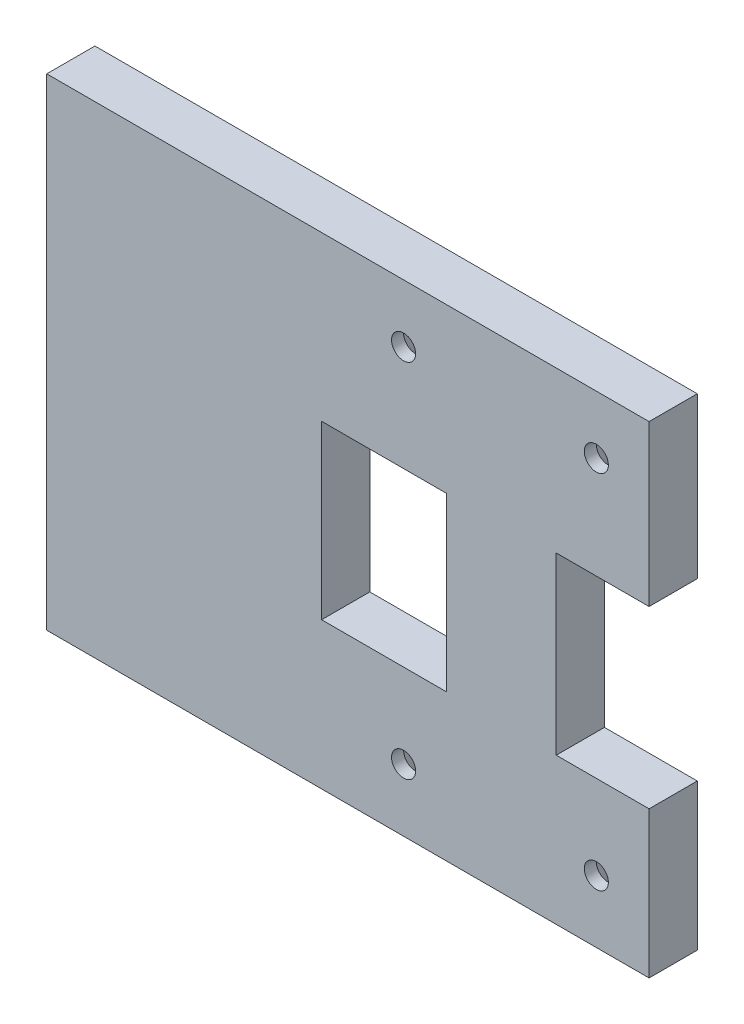
ISO-10303-21;
HEADER;
FILE_DESCRIPTION(('STEP AP214'),'2;1');
FILE_NAME('part.step','',(''),(''),'','','');
FILE_SCHEMA(('AUTOMOTIVE_DESIGN { 1 0 10303 214 1 1 1 1 }'));
ENDSEC;
DATA;
#1=APPLICATION_CONTEXT('core data for automotive mechanical design processes');
#2=APPLICATION_PROTOCOL_DEFINITION('international standard','automotive_design',2000,#1);
#3=PRODUCT_CONTEXT('',#1,'mechanical');
#4=PRODUCT('Part','Part','',(#3));
#5=PRODUCT_RELATED_PRODUCT_CATEGORY('part','',(#4));
#6=PRODUCT_DEFINITION_FORMATION('','',#4);
#7=PRODUCT_DEFINITION_CONTEXT('part definition',#1,'design');
#8=PRODUCT_DEFINITION('design','',#6,#7);
#9=PRODUCT_DEFINITION_SHAPE('','',#8);
#10=(LENGTH_UNIT() NAMED_UNIT(*) SI_UNIT(.MILLI.,.METRE.));
#11=(NAMED_UNIT(*) PLANE_ANGLE_UNIT() SI_UNIT($,.RADIAN.));
#12=(NAMED_UNIT(*) SI_UNIT($,.STERADIAN.) SOLID_ANGLE_UNIT());
#13=UNCERTAINTY_MEASURE_WITH_UNIT(LENGTH_MEASURE(1.E-05),#10,'distance_accuracy_value','');
#14=(GEOMETRIC_REPRESENTATION_CONTEXT(3) GLOBAL_UNCERTAINTY_ASSIGNED_CONTEXT((#13)) GLOBAL_UNIT_ASSIGNED_CONTEXT((#10,
#11,#12)) REPRESENTATION_CONTEXT('',''));
#15=CARTESIAN_POINT('',(0.,0.,0.));
#16=DIRECTION('',(0.,0.,1.));
#17=DIRECTION('',(1.,0.,0.));
#18=AXIS2_PLACEMENT_3D('',#15,#16,#17);
#19=CARTESIAN_POINT('',(23.535533830237,118.834695644579,38.811611196935));
#20=DIRECTION('',(1.,0.,0.));
#21=DIRECTION('',(0.,0.,-1.));
#22=AXIS2_PLACEMENT_3D('',#19,#20,#21);
#23=PLANE('',#22);
#24=DIRECTION('',(0.,0.,1.));
#25=VECTOR('',#24,1.);
#26=CARTESIAN_POINT('',(23.535533830237,90.998083665127,34.811611196935));
#27=LINE('',#26,#25);
#28=CARTESIAN_POINT('',(23.535533830237,90.998083665127,34.811611196935));
#29=VERTEX_POINT('',#28);
#30=CARTESIAN_POINT('',(23.535533830237,90.998083665127,38.811611196935));
#31=VERTEX_POINT('',#30);
#32=EDGE_CURVE('E176',#29,#31,#27,.T.);
#33=ORIENTED_EDGE('',*,*,#32,.T.);
#34=DIRECTION('',(0.,-1.,0.));
#35=VECTOR('',#34,1.);
#36=CARTESIAN_POINT('',(23.535533830237,118.834695644579,38.811611196935));
#37=LINE('',#36,#35);
#38=CARTESIAN_POINT('',(23.535533830237,78.834695644579,38.811611196935));
#39=VERTEX_POINT('',#38);
#40=EDGE_CURVE('E195',#31,#39,#37,.T.);
#41=ORIENTED_EDGE('',*,*,#40,.T.);
#42=DIRECTION('',(0.,0.,-1.));
#43=VECTOR('',#42,1.);
#44=CARTESIAN_POINT('',(23.535533830237,78.834695644579,38.811611196935));
#45=LINE('',#44,#43);
#46=CARTESIAN_POINT('',(23.535533830237,78.834695644579,34.811611196935));
#47=VERTEX_POINT('',#46);
#48=EDGE_CURVE('E217',#39,#47,#45,.T.);
#49=ORIENTED_EDGE('',*,*,#48,.T.);
#50=DIRECTION('',(0.,-1.,0.));
#51=VECTOR('',#50,1.);
#52=CARTESIAN_POINT('',(23.535533830237,118.834695644579,34.811611196935));
#53=LINE('',#52,#51);
#54=EDGE_CURVE('E208',#29,#47,#53,.T.);
#55=ORIENTED_EDGE('',*,*,#54,.F.);
#56=EDGE_LOOP('',(#33,#41,#49,#55));
#57=FACE_BOUND('',#56,.T.);
#58=ADVANCED_FACE('F36',(#57),#23,.T.);
#59=CARTESIAN_POINT('',(-26.464466169763,118.834695644579,38.811611196935));
#60=DIRECTION('',(0.,1.,0.));
#61=DIRECTION('',(0.,0.,1.));
#62=AXIS2_PLACEMENT_3D('',#59,#60,#61);
#63=PLANE('',#62);
#64=DIRECTION('',(1.,0.,0.));
#65=VECTOR('',#64,1.);
#66=CARTESIAN_POINT('',(-26.464466169763,118.834695644579,34.811611196935));
#67=LINE('',#66,#65);
#68=CARTESIAN_POINT('',(-26.464466169763,118.834695644579,34.811611196935));
#69=VERTEX_POINT('',#68);
#70=CARTESIAN_POINT('',(23.535533830237,118.834695644579,34.811611196935));
#71=VERTEX_POINT('',#70);
#72=EDGE_CURVE('E185',#69,#71,#67,.T.);
#73=ORIENTED_EDGE('',*,*,#72,.F.);
#74=DIRECTION('',(0.,0.,-1.));
#75=VECTOR('',#74,1.);
#76=CARTESIAN_POINT('',(-26.464466169763,118.834695644579,38.811611196935));
#77=LINE('',#76,#75);
#78=CARTESIAN_POINT('',(-26.464466169763,118.834695644579,38.811611196935));
#79=VERTEX_POINT('',#78);
#80=EDGE_CURVE('E11',#79,#69,#77,.T.);
#81=ORIENTED_EDGE('',*,*,#80,.F.);
#82=DIRECTION('',(1.,0.,0.));
#83=VECTOR('',#82,1.);
#84=CARTESIAN_POINT('',(-26.464466169763,118.834695644579,38.811611196935));
#85=LINE('',#84,#83);
#86=CARTESIAN_POINT('',(23.535533830237,118.834695644579,38.811611196935));
#87=VERTEX_POINT('',#86);
#88=EDGE_CURVE('E192',#79,#87,#85,.T.);
#89=ORIENTED_EDGE('',*,*,#88,.T.);
#90=DIRECTION('',(0.,0.,-1.));
#91=VECTOR('',#90,1.);
#92=CARTESIAN_POINT('',(23.535533830237,118.834695644579,38.811611196935));
#93=LINE('',#92,#91);
#94=EDGE_CURVE('E40',#87,#71,#93,.T.);
#95=ORIENTED_EDGE('',*,*,#94,.T.);
#96=EDGE_LOOP('',(#73,#81,#89,#95));
#97=FACE_BOUND('',#96,.T.);
#98=ADVANCED_FACE('F38',(#97),#63,.T.);
#99=CARTESIAN_POINT('',(-26.464466169763,78.834695644579,38.811611196935));
#100=DIRECTION('',(-1.,0.,0.));
#101=DIRECTION('',(0.,0.,1.));
#102=AXIS2_PLACEMENT_3D('',#99,#100,#101);
#103=PLANE('',#102);
#104=DIRECTION('',(0.,1.,0.));
#105=VECTOR('',#104,1.);
#106=CARTESIAN_POINT('',(-26.464466169763,78.834695644579,34.811611196935));
#107=LINE('',#106,#105);
#108=CARTESIAN_POINT('',(-26.464466169763,78.834695644579,34.811611196935));
#109=VERTEX_POINT('',#108);
#110=EDGE_CURVE('E196',#109,#69,#107,.T.);
#111=ORIENTED_EDGE('',*,*,#110,.F.);
#112=DIRECTION('',(0.,0.,-1.));
#113=VECTOR('',#112,1.);
#114=CARTESIAN_POINT('',(-26.464466169763,78.834695644579,38.811611196935));
#115=LINE('',#114,#113);
#116=CARTESIAN_POINT('',(-26.464466169763,78.834695644579,38.811611196935));
#117=VERTEX_POINT('',#116);
#118=EDGE_CURVE('E45',#117,#109,#115,.T.);
#119=ORIENTED_EDGE('',*,*,#118,.F.);
#120=DIRECTION('',(0.,1.,0.));
#121=VECTOR('',#120,1.);
#122=CARTESIAN_POINT('',(-26.464466169763,78.834695644579,38.811611196935));
#123=LINE('',#122,#121);
#124=EDGE_CURVE('E203',#117,#79,#123,.T.);
#125=ORIENTED_EDGE('',*,*,#124,.T.);
#126=ORIENTED_EDGE('',*,*,#80,.T.);
#127=EDGE_LOOP('',(#111,#119,#125,#126));
#128=FACE_BOUND('',#127,.T.);
#129=ADVANCED_FACE('F233',(#128),#103,.T.);
#130=CARTESIAN_POINT('',(23.535533830237,78.834695644579,38.811611196935));
#131=DIRECTION('',(0.,-1.,0.));
#132=DIRECTION('',(0.,0.,-1.));
#133=AXIS2_PLACEMENT_3D('',#130,#131,#132);
#134=PLANE('',#133);
#135=DIRECTION('',(-1.,0.,0.));
#136=VECTOR('',#135,1.);
#137=CARTESIAN_POINT('',(23.535533830237,78.834695644579,34.811611196935));
#138=LINE('',#137,#136);
#139=EDGE_CURVE('E212',#47,#109,#138,.T.);
#140=ORIENTED_EDGE('',*,*,#139,.F.);
#141=ORIENTED_EDGE('',*,*,#48,.F.);
#142=DIRECTION('',(-1.,0.,0.));
#143=VECTOR('',#142,1.);
#144=CARTESIAN_POINT('',(23.535533830237,78.834695644579,38.811611196935));
#145=LINE('',#144,#143);
#146=EDGE_CURVE('E200',#39,#117,#145,.T.);
#147=ORIENTED_EDGE('',*,*,#146,.T.);
#148=ORIENTED_EDGE('',*,*,#118,.T.);
#149=EDGE_LOOP('',(#140,#141,#147,#148));
#150=FACE_BOUND('',#149,.T.);
#151=ADVANCED_FACE('F251',(#150),#134,.T.);
#152=DIRECTION('',(0.,0.,1.));
#153=VECTOR('',#152,1.);
#154=CARTESIAN_POINT('',(23.535533830237,105.537173801269,34.811611196935));
#155=LINE('',#154,#153);
#156=CARTESIAN_POINT('',(23.535533830237,105.537173801269,34.811611196935));
#157=VERTEX_POINT('',#156);
#158=CARTESIAN_POINT('',(23.535533830237,105.537173801269,38.811611196935));
#159=VERTEX_POINT('',#158);
#160=EDGE_CURVE('E188',#157,#159,#155,.T.);
#161=ORIENTED_EDGE('',*,*,#160,.F.);
#162=EDGE_CURVE('E209',#71,#157,#53,.T.);
#163=ORIENTED_EDGE('',*,*,#162,.F.);
#164=ORIENTED_EDGE('',*,*,#94,.F.);
#165=EDGE_CURVE('E197',#87,#159,#37,.T.);
#166=ORIENTED_EDGE('',*,*,#165,.T.);
#167=EDGE_LOOP('',(#161,#163,#164,#166));
#168=FACE_BOUND('',#167,.T.);
#169=ADVANCED_FACE('F230',(#168),#23,.T.);
#170=CARTESIAN_POINT('',(0.,0.,38.811611196935));
#171=DIRECTION('',(0.,0.,-1.));
#172=DIRECTION('',(-1.,0.,0.));
#173=AXIS2_PLACEMENT_3D('',#170,#171,#172);
#174=PLANE('',#173);
#175=CARTESIAN_POINT('',(3.1566464785643,84.0163406690859,38.811611196935));
#176=DIRECTION('',(0.,0.,-1.));
#177=DIRECTION('',(-1.,0.,0.));
#178=AXIS2_PLACEMENT_3D('',#175,#176,#177);
#179=CIRCLE('',#178,0.999999999999987);
#180=CARTESIAN_POINT('',(2.15664647856431,84.0163406690859,38.811611196935));
#181=VERTEX_POINT('',#180);
#182=EDGE_CURVE('E487',#181,#181,#179,.T.);
#183=ORIENTED_EDGE('',*,*,#182,.T.);
#184=EDGE_LOOP('',(#183));
#185=FACE_BOUND('',#184,.T.);
#186=CARTESIAN_POINT('',(19.1566464785643,84.0163406690859,38.811611196935));
#187=DIRECTION('',(0.,0.,-1.));
#188=DIRECTION('',(-1.,0.,0.));
#189=AXIS2_PLACEMENT_3D('',#186,#187,#188);
#190=CIRCLE('',#189,0.999999999999987);
#191=CARTESIAN_POINT('',(18.1566464785643,84.0163406690859,38.811611196935));
#192=VERTEX_POINT('',#191);
#193=EDGE_CURVE('E498',#192,#192,#190,.T.);
#194=ORIENTED_EDGE('',*,*,#193,.T.);
#195=EDGE_LOOP('',(#194));
#196=FACE_BOUND('',#195,.T.);
#197=CARTESIAN_POINT('',(19.1566464785643,114.016340669086,38.811611196935));
#198=DIRECTION('',(0.,0.,-1.));
#199=DIRECTION('',(-1.,0.,0.));
#200=AXIS2_PLACEMENT_3D('',#197,#198,#199);
#201=CIRCLE('',#200,0.999999999999987);
#202=CARTESIAN_POINT('',(18.1566464785643,114.016340669086,38.811611196935));
#203=VERTEX_POINT('',#202);
#204=EDGE_CURVE('E507',#203,#203,#201,.T.);
#205=ORIENTED_EDGE('',*,*,#204,.T.);
#206=EDGE_LOOP('',(#205));
#207=FACE_BOUND('',#206,.T.);
#208=CARTESIAN_POINT('',(3.1566464785643,114.016340669086,38.811611196935));
#209=DIRECTION('',(0.,0.,-1.));
#210=DIRECTION('',(-1.,0.,0.));
#211=AXIS2_PLACEMENT_3D('',#208,#209,#210);
#212=CIRCLE('',#211,0.999999999999987);
#213=CARTESIAN_POINT('',(2.15664647856431,114.016340669086,38.811611196935));
#214=VERTEX_POINT('',#213);
#215=EDGE_CURVE('E150',#214,#214,#212,.T.);
#216=ORIENTED_EDGE('',*,*,#215,.T.);
#217=EDGE_LOOP('',(#216));
#218=FACE_BOUND('',#217,.T.);
#219=DIRECTION('',(-1.,0.,0.));
#220=VECTOR('',#219,1.);
#221=CARTESIAN_POINT('',(6.7256548183099,105.265415107135,38.811611196935));
#222=LINE('',#221,#220);
#223=CARTESIAN_POINT('',(6.7256548183099,105.265415107135,38.811611196935));
#224=VERTEX_POINT('',#223);
#225=CARTESIAN_POINT('',(-3.6464686744518,105.265415107135,38.811611196935));
#226=VERTEX_POINT('',#225);
#227=EDGE_CURVE('E156',#224,#226,#222,.T.);
#228=ORIENTED_EDGE('',*,*,#227,.F.);
#229=DIRECTION('',(0.,1.,0.));
#230=VECTOR('',#229,1.);
#231=CARTESIAN_POINT('',(6.7256548183099,90.998083665127,38.811611196935));
#232=LINE('',#231,#230);
#233=CARTESIAN_POINT('',(6.7256548183099,90.998083665127,38.811611196935));
#234=VERTEX_POINT('',#233);
#235=EDGE_CURVE('E53',#234,#224,#232,.T.);
#236=ORIENTED_EDGE('',*,*,#235,.F.);
#237=DIRECTION('',(1.,0.,0.));
#238=VECTOR('',#237,1.);
#239=CARTESIAN_POINT('',(-3.6464686744518,90.998083665127,38.811611196935));
#240=LINE('',#239,#238);
#241=CARTESIAN_POINT('',(-3.6464686744518,90.998083665127,38.811611196935));
#242=VERTEX_POINT('',#241);
#243=EDGE_CURVE('E144',#242,#234,#240,.T.);
#244=ORIENTED_EDGE('',*,*,#243,.F.);
#245=DIRECTION('',(0.,-1.,0.));
#246=VECTOR('',#245,1.);
#247=CARTESIAN_POINT('',(-3.6464686744518,105.265415107135,38.811611196935));
#248=LINE('',#247,#246);
#249=EDGE_CURVE('E147',#226,#242,#248,.T.);
#250=ORIENTED_EDGE('',*,*,#249,.F.);
#251=EDGE_LOOP('',(#228,#236,#244,#250));
#252=FACE_BOUND('',#251,.T.);
#253=ORIENTED_EDGE('',*,*,#40,.F.);
#254=DIRECTION('',(1.,0.,0.));
#255=VECTOR('',#254,1.);
#256=CARTESIAN_POINT('',(15.8295710717819,90.998083665127,38.811611196935));
#257=LINE('',#256,#255);
#258=CARTESIAN_POINT('',(15.8295710717819,90.998083665127,38.811611196935));
#259=VERTEX_POINT('',#258);
#260=EDGE_CURVE('E162',#259,#31,#257,.T.);
#261=ORIENTED_EDGE('',*,*,#260,.F.);
#262=DIRECTION('',(0.,-1.,0.));
#263=VECTOR('',#262,1.);
#264=CARTESIAN_POINT('',(15.8295710717819,105.537173801269,38.811611196935));
#265=LINE('',#264,#263);
#266=CARTESIAN_POINT('',(15.8295710717819,105.537173801269,38.811611196935));
#267=VERTEX_POINT('',#266);
#268=EDGE_CURVE('E170',#267,#259,#265,.T.);
#269=ORIENTED_EDGE('',*,*,#268,.F.);
#270=DIRECTION('',(-1.,0.,0.));
#271=VECTOR('',#270,1.);
#272=CARTESIAN_POINT('',(23.535533830237,105.537173801269,38.811611196935));
#273=LINE('',#272,#271);
#274=EDGE_CURVE('E178',#159,#267,#273,.T.);
#275=ORIENTED_EDGE('',*,*,#274,.F.);
#276=ORIENTED_EDGE('',*,*,#165,.F.);
#277=ORIENTED_EDGE('',*,*,#88,.F.);
#278=ORIENTED_EDGE('',*,*,#124,.F.);
#279=ORIENTED_EDGE('',*,*,#146,.F.);
#280=EDGE_LOOP('',(#253,#261,#269,#275,#276,#277,#278,#279));
#281=FACE_BOUND('',#280,.T.);
#282=ADVANCED_FACE('F237',(#185,#196,#207,#218,#252,#281),#174,.F.);
#283=CARTESIAN_POINT('',(0.,0.,34.811611196935));
#284=DIRECTION('',(0.,0.,-1.));
#285=DIRECTION('',(-1.,0.,0.));
#286=AXIS2_PLACEMENT_3D('',#283,#284,#285);
#287=PLANE('',#286);
#288=CARTESIAN_POINT('',(3.1566464785643,84.0163406690859,34.811611196935));
#289=DIRECTION('',(0.,0.,-1.));
#290=DIRECTION('',(-1.,0.,0.));
#291=AXIS2_PLACEMENT_3D('',#288,#289,#290);
#292=CIRCLE('',#291,4.);
#293=CARTESIAN_POINT('',(-0.843353521435698,84.0163406690859,34.811611196935));
#294=VERTEX_POINT('',#293);
#295=EDGE_CURVE('E485',#294,#294,#292,.T.);
#296=ORIENTED_EDGE('',*,*,#295,.F.);
#297=EDGE_LOOP('',(#296));
#298=FACE_BOUND('',#297,.T.);
#299=CARTESIAN_POINT('',(19.1566464785643,84.0163406690859,34.811611196935));
#300=DIRECTION('',(0.,0.,-1.));
#301=DIRECTION('',(-1.,0.,0.));
#302=AXIS2_PLACEMENT_3D('',#299,#300,#301);
#303=CIRCLE('',#302,4.);
#304=CARTESIAN_POINT('',(15.1566464785643,84.0163406690859,34.811611196935));
#305=VERTEX_POINT('',#304);
#306=EDGE_CURVE('E492',#305,#305,#303,.T.);
#307=ORIENTED_EDGE('',*,*,#306,.F.);
#308=EDGE_LOOP('',(#307));
#309=FACE_BOUND('',#308,.T.);
#310=CARTESIAN_POINT('',(19.1566464785643,114.016340669086,34.811611196935));
#311=DIRECTION('',(0.,0.,-1.));
#312=DIRECTION('',(-1.,0.,0.));
#313=AXIS2_PLACEMENT_3D('',#310,#311,#312);
#314=CIRCLE('',#313,4.);
#315=CARTESIAN_POINT('',(15.1566464785643,114.016340669086,34.811611196935));
#316=VERTEX_POINT('',#315);
#317=EDGE_CURVE('E501',#316,#316,#314,.T.);
#318=ORIENTED_EDGE('',*,*,#317,.F.);
#319=EDGE_LOOP('',(#318));
#320=FACE_BOUND('',#319,.T.);
#321=CARTESIAN_POINT('',(3.1566464785643,114.016340669086,34.811611196935));
#322=DIRECTION('',(0.,0.,-1.));
#323=DIRECTION('',(-1.,0.,0.));
#324=AXIS2_PLACEMENT_3D('',#321,#322,#323);
#325=CIRCLE('',#324,4.);
#326=CARTESIAN_POINT('',(-0.843353521435698,114.016340669086,34.811611196935));
#327=VERTEX_POINT('',#326);
#328=EDGE_CURVE('E510',#327,#327,#325,.T.);
#329=ORIENTED_EDGE('',*,*,#328,.F.);
#330=EDGE_LOOP('',(#329));
#331=FACE_BOUND('',#330,.T.);
#332=DIRECTION('',(0.,1.,0.));
#333=VECTOR('',#332,1.);
#334=CARTESIAN_POINT('',(6.7256548183099,90.998083665127,34.811611196935));
#335=LINE('',#334,#333);
#336=CARTESIAN_POINT('',(6.7256548183099,90.998083665127,34.811611196935));
#337=VERTEX_POINT('',#336);
#338=CARTESIAN_POINT('',(6.7256548183099,105.265415107135,34.811611196935));
#339=VERTEX_POINT('',#338);
#340=EDGE_CURVE('E128',#337,#339,#335,.T.);
#341=ORIENTED_EDGE('',*,*,#340,.T.);
#342=DIRECTION('',(-1.,0.,0.));
#343=VECTOR('',#342,1.);
#344=CARTESIAN_POINT('',(6.7256548183099,105.265415107135,34.811611196935));
#345=LINE('',#344,#343);
#346=CARTESIAN_POINT('',(-3.6464686744518,105.265415107135,34.811611196935));
#347=VERTEX_POINT('',#346);
#348=EDGE_CURVE('E137',#339,#347,#345,.T.);
#349=ORIENTED_EDGE('',*,*,#348,.T.);
#350=DIRECTION('',(0.,-1.,0.));
#351=VECTOR('',#350,1.);
#352=CARTESIAN_POINT('',(-3.6464686744518,105.265415107135,34.811611196935));
#353=LINE('',#352,#351);
#354=CARTESIAN_POINT('',(-3.6464686744518,90.998083665127,34.811611196935));
#355=VERTEX_POINT('',#354);
#356=EDGE_CURVE('E61',#347,#355,#353,.T.);
#357=ORIENTED_EDGE('',*,*,#356,.T.);
#358=DIRECTION('',(1.,0.,0.));
#359=VECTOR('',#358,1.);
#360=CARTESIAN_POINT('',(-3.6464686744518,90.998083665127,34.811611196935));
#361=LINE('',#360,#359);
#362=EDGE_CURVE('E134',#355,#337,#361,.T.);
#363=ORIENTED_EDGE('',*,*,#362,.T.);
#364=EDGE_LOOP('',(#341,#349,#357,#363));
#365=FACE_BOUND('',#364,.T.);
#366=DIRECTION('',(1.,0.,0.));
#367=VECTOR('',#366,1.);
#368=CARTESIAN_POINT('',(15.8295710717819,90.998083665127,34.811611196935));
#369=LINE('',#368,#367);
#370=CARTESIAN_POINT('',(15.8295710717819,90.998083665127,34.811611196935));
#371=VERTEX_POINT('',#370);
#372=EDGE_CURVE('E166',#371,#29,#369,.T.);
#373=ORIENTED_EDGE('',*,*,#372,.T.);
#374=ORIENTED_EDGE('',*,*,#54,.T.);
#375=ORIENTED_EDGE('',*,*,#139,.T.);
#376=ORIENTED_EDGE('',*,*,#110,.T.);
#377=ORIENTED_EDGE('',*,*,#72,.T.);
#378=ORIENTED_EDGE('',*,*,#162,.T.);
#379=DIRECTION('',(-1.,0.,0.));
#380=VECTOR('',#379,1.);
#381=CARTESIAN_POINT('',(23.535533830237,105.537173801269,34.811611196935));
#382=LINE('',#381,#380);
#383=CARTESIAN_POINT('',(15.8295710717819,105.537173801269,34.811611196935));
#384=VERTEX_POINT('',#383);
#385=EDGE_CURVE('E169',#157,#384,#382,.T.);
#386=ORIENTED_EDGE('',*,*,#385,.T.);
#387=DIRECTION('',(0.,-1.,0.));
#388=VECTOR('',#387,1.);
#389=CARTESIAN_POINT('',(15.8295710717819,105.537173801269,34.811611196935));
#390=LINE('',#389,#388);
#391=EDGE_CURVE('E173',#384,#371,#390,.T.);
#392=ORIENTED_EDGE('',*,*,#391,.T.);
#393=EDGE_LOOP('',(#373,#374,#375,#376,#377,#378,#386,#392));
#394=FACE_BOUND('',#393,.T.);
#395=ADVANCED_FACE('F141',(#298,#309,#320,#331,#365,#394),#287,.T.);
#396=CARTESIAN_POINT('',(15.8295710717819,90.998083665127,34.811611196935));
#397=DIRECTION('',(0.,-1.,0.));
#398=DIRECTION('',(0.,0.,-1.));
#399=AXIS2_PLACEMENT_3D('',#396,#397,#398);
#400=PLANE('',#399);
#401=ORIENTED_EDGE('',*,*,#260,.T.);
#402=ORIENTED_EDGE('',*,*,#32,.F.);
#403=ORIENTED_EDGE('',*,*,#372,.F.);
#404=DIRECTION('',(0.,0.,1.));
#405=VECTOR('',#404,1.);
#406=CARTESIAN_POINT('',(15.8295710717819,90.998083665127,34.811611196935));
#407=LINE('',#406,#405);
#408=EDGE_CURVE('E183',#371,#259,#407,.T.);
#409=ORIENTED_EDGE('',*,*,#408,.T.);
#410=EDGE_LOOP('',(#401,#402,#403,#409));
#411=FACE_BOUND('',#410,.T.);
#412=ADVANCED_FACE('F249',(#411),#400,.F.);
#413=CARTESIAN_POINT('',(15.8295710717819,105.537173801269,34.811611196935));
#414=DIRECTION('',(-1.,0.,0.));
#415=DIRECTION('',(0.,0.,1.));
#416=AXIS2_PLACEMENT_3D('',#413,#414,#415);
#417=PLANE('',#416);
#418=ORIENTED_EDGE('',*,*,#268,.T.);
#419=ORIENTED_EDGE('',*,*,#408,.F.);
#420=ORIENTED_EDGE('',*,*,#391,.F.);
#421=DIRECTION('',(0.,0.,1.));
#422=VECTOR('',#421,1.);
#423=CARTESIAN_POINT('',(15.8295710717819,105.537173801269,34.811611196935));
#424=LINE('',#423,#422);
#425=EDGE_CURVE('E186',#384,#267,#424,.T.);
#426=ORIENTED_EDGE('',*,*,#425,.T.);
#427=EDGE_LOOP('',(#418,#419,#420,#426));
#428=FACE_BOUND('',#427,.T.);
#429=ADVANCED_FACE('F247',(#428),#417,.F.);
#430=CARTESIAN_POINT('',(23.535533830237,105.537173801269,34.811611196935));
#431=DIRECTION('',(0.,1.,0.));
#432=DIRECTION('',(0.,0.,1.));
#433=AXIS2_PLACEMENT_3D('',#430,#431,#432);
#434=PLANE('',#433);
#435=ORIENTED_EDGE('',*,*,#274,.T.);
#436=ORIENTED_EDGE('',*,*,#425,.F.);
#437=ORIENTED_EDGE('',*,*,#385,.F.);
#438=ORIENTED_EDGE('',*,*,#160,.T.);
#439=EDGE_LOOP('',(#435,#436,#437,#438));
#440=FACE_BOUND('',#439,.T.);
#441=ADVANCED_FACE('F244',(#440),#434,.F.);
#442=CARTESIAN_POINT('',(6.7256548183099,90.998083665127,34.811611196935));
#443=DIRECTION('',(1.,0.,0.));
#444=DIRECTION('',(0.,0.,-1.));
#445=AXIS2_PLACEMENT_3D('',#442,#443,#444);
#446=PLANE('',#445);
#447=ORIENTED_EDGE('',*,*,#235,.T.);
#448=DIRECTION('',(0.,0.,1.));
#449=VECTOR('',#448,1.);
#450=CARTESIAN_POINT('',(6.7256548183099,105.265415107135,34.811611196935));
#451=LINE('',#450,#449);
#452=EDGE_CURVE('E124',#339,#224,#451,.T.);
#453=ORIENTED_EDGE('',*,*,#452,.F.);
#454=ORIENTED_EDGE('',*,*,#340,.F.);
#455=DIRECTION('',(0.,0.,1.));
#456=VECTOR('',#455,1.);
#457=CARTESIAN_POINT('',(6.7256548183099,90.998083665127,34.811611196935));
#458=LINE('',#457,#456);
#459=EDGE_CURVE('E160',#337,#234,#458,.T.);
#460=ORIENTED_EDGE('',*,*,#459,.T.);
#461=EDGE_LOOP('',(#447,#453,#454,#460));
#462=FACE_BOUND('',#461,.T.);
#463=ADVANCED_FACE('F126',(#462),#446,.F.);
#464=CARTESIAN_POINT('',(-3.6464686744518,90.998083665127,34.811611196935));
#465=DIRECTION('',(0.,-1.,0.));
#466=DIRECTION('',(0.,0.,-1.));
#467=AXIS2_PLACEMENT_3D('',#464,#465,#466);
#468=PLANE('',#467);
#469=ORIENTED_EDGE('',*,*,#243,.T.);
#470=ORIENTED_EDGE('',*,*,#459,.F.);
#471=ORIENTED_EDGE('',*,*,#362,.F.);
#472=DIRECTION('',(0.,0.,1.));
#473=VECTOR('',#472,1.);
#474=CARTESIAN_POINT('',(-3.6464686744518,90.998083665127,34.811611196935));
#475=LINE('',#474,#473);
#476=EDGE_CURVE('E163',#355,#242,#475,.T.);
#477=ORIENTED_EDGE('',*,*,#476,.T.);
#478=EDGE_LOOP('',(#469,#470,#471,#477));
#479=FACE_BOUND('',#478,.T.);
#480=ADVANCED_FACE('F326',(#479),#468,.F.);
#481=CARTESIAN_POINT('',(-3.6464686744518,105.265415107135,34.811611196935));
#482=DIRECTION('',(-1.,0.,0.));
#483=DIRECTION('',(0.,0.,1.));
#484=AXIS2_PLACEMENT_3D('',#481,#482,#483);
#485=PLANE('',#484);
#486=ORIENTED_EDGE('',*,*,#249,.T.);
#487=ORIENTED_EDGE('',*,*,#476,.F.);
#488=ORIENTED_EDGE('',*,*,#356,.F.);
#489=DIRECTION('',(0.,0.,1.));
#490=VECTOR('',#489,1.);
#491=CARTESIAN_POINT('',(-3.6464686744518,105.265415107135,34.811611196935));
#492=LINE('',#491,#490);
#493=EDGE_CURVE('E133',#347,#226,#492,.T.);
#494=ORIENTED_EDGE('',*,*,#493,.T.);
#495=EDGE_LOOP('',(#486,#487,#488,#494));
#496=FACE_BOUND('',#495,.T.);
#497=ADVANCED_FACE('F336',(#496),#485,.F.);
#498=CARTESIAN_POINT('',(6.7256548183099,105.265415107135,34.811611196935));
#499=DIRECTION('',(0.,1.,0.));
#500=DIRECTION('',(0.,0.,1.));
#501=AXIS2_PLACEMENT_3D('',#498,#499,#500);
#502=PLANE('',#501);
#503=ORIENTED_EDGE('',*,*,#227,.T.);
#504=ORIENTED_EDGE('',*,*,#493,.F.);
#505=ORIENTED_EDGE('',*,*,#348,.F.);
#506=ORIENTED_EDGE('',*,*,#452,.T.);
#507=EDGE_LOOP('',(#503,#504,#505,#506));
#508=FACE_BOUND('',#507,.T.);
#509=ADVANCED_FACE('F138',(#508),#502,.F.);
#510=CARTESIAN_POINT('',(3.1566464785643,114.016340669086,34.811611196935));
#511=DIRECTION('',(0.,0.,-1.));
#512=DIRECTION('',(-1.,0.,0.));
#513=AXIS2_PLACEMENT_3D('',#510,#511,#512);
#514=CYLINDRICAL_SURFACE('',#513,0.999999999999987);
#515=ORIENTED_EDGE('',*,*,#215,.F.);
#516=EDGE_LOOP('',(#515));
#517=FACE_BOUND('',#516,.T.);
#518=CARTESIAN_POINT('',(3.1566464785643,114.016340669086,37.811611196935));
#519=DIRECTION('',(0.,0.,-1.));
#520=DIRECTION('',(-1.,0.,0.));
#521=AXIS2_PLACEMENT_3D('',#518,#519,#520);
#522=CIRCLE('',#521,0.999999999999987);
#523=CARTESIAN_POINT('',(2.15664647856431,114.016340669086,37.811611196935));
#524=VERTEX_POINT('',#523);
#525=EDGE_CURVE('E512',#524,#524,#522,.T.);
#526=ORIENTED_EDGE('',*,*,#525,.T.);
#527=EDGE_LOOP('',(#526));
#528=FACE_BOUND('',#527,.T.);
#529=ADVANCED_FACE('F356',(#517,#528),#514,.F.);
#530=CARTESIAN_POINT('',(3.1566464785643,114.016340669086,34.811611196935));
#531=DIRECTION('',(0.,0.,-1.));
#532=DIRECTION('',(-1.,0.,0.));
#533=AXIS2_PLACEMENT_3D('',#530,#531,#532);
#534=CONICAL_SURFACE('',#533,4.,0.785398163397448);
#535=CARTESIAN_POINT('',(2.15664647856431,114.016340669086,37.811611196935));
#536=CARTESIAN_POINT('',(2.12539647856431,114.016340669086,37.780361196935));
#537=CARTESIAN_POINT('',(2.09414647856431,114.016340669086,37.749111196935));
#538=CARTESIAN_POINT('',(2.03164647856431,114.016340669086,37.686611196935));
#539=CARTESIAN_POINT('',(2.00039647856432,114.016340669086,37.655361196935));
#540=CARTESIAN_POINT('',(1.93789647856431,114.016340669086,37.592861196935));
#541=CARTESIAN_POINT('',(1.90664647856431,114.016340669086,37.561611196935));
#542=CARTESIAN_POINT('',(1.84414647856431,114.016340669086,37.499111196935));
#543=CARTESIAN_POINT('',(1.81289647856431,114.016340669086,37.467861196935));
#544=CARTESIAN_POINT('',(1.75039647856431,114.016340669086,37.405361196935));
#545=CARTESIAN_POINT('',(1.71914647856431,114.016340669086,37.374111196935));
#546=CARTESIAN_POINT('',(1.65664647856431,114.016340669086,37.311611196935));
#547=CARTESIAN_POINT('',(1.62539647856431,114.016340669086,37.280361196935));
#548=CARTESIAN_POINT('',(1.56289647856431,114.016340669086,37.217861196935));
#549=CARTESIAN_POINT('',(1.53164647856431,114.016340669086,37.186611196935));
#550=CARTESIAN_POINT('',(1.46914647856431,114.016340669086,37.124111196935));
#551=CARTESIAN_POINT('',(1.43789647856431,114.016340669086,37.092861196935));
#552=CARTESIAN_POINT('',(1.37539647856431,114.016340669086,37.030361196935));
#553=CARTESIAN_POINT('',(1.34414647856431,114.016340669086,36.999111196935));
#554=CARTESIAN_POINT('',(1.28164647856431,114.016340669086,36.936611196935));
#555=CARTESIAN_POINT('',(1.25039647856431,114.016340669086,36.905361196935));
#556=CARTESIAN_POINT('',(1.18789647856431,114.016340669086,36.842861196935));
#557=CARTESIAN_POINT('',(1.15664647856431,114.016340669086,36.811611196935));
#558=CARTESIAN_POINT('',(1.09414647856431,114.016340669086,36.749111196935));
#559=CARTESIAN_POINT('',(1.06289647856431,114.016340669086,36.717861196935));
#560=CARTESIAN_POINT('',(1.00039647856431,114.016340669086,36.655361196935));
#561=CARTESIAN_POINT('',(0.96914647856431,114.016340669086,36.624111196935));
#562=CARTESIAN_POINT('',(0.90664647856431,114.016340669086,36.561611196935));
#563=CARTESIAN_POINT('',(0.875396478564309,114.016340669086,36.530361196935));
#564=CARTESIAN_POINT('',(0.812896478564309,114.016340669086,36.467861196935));
#565=CARTESIAN_POINT('',(0.781646478564309,114.016340669086,36.436611196935));
#566=CARTESIAN_POINT('',(0.719146478564309,114.016340669086,36.374111196935));
#567=CARTESIAN_POINT('',(0.687896478564308,114.016340669086,36.342861196935));
#568=CARTESIAN_POINT('',(0.625396478564307,114.016340669086,36.280361196935));
#569=CARTESIAN_POINT('',(0.594146478564308,114.016340669086,36.249111196935));
#570=CARTESIAN_POINT('',(0.531646478564308,114.016340669086,36.186611196935));
#571=CARTESIAN_POINT('',(0.500396478564308,114.016340669086,36.155361196935));
#572=CARTESIAN_POINT('',(0.437896478564307,114.016340669086,36.092861196935));
#573=CARTESIAN_POINT('',(0.406646478564307,114.016340669086,36.061611196935));
#574=CARTESIAN_POINT('',(0.344146478564307,114.016340669086,35.999111196935));
#575=CARTESIAN_POINT('',(0.312896478564307,114.016340669086,35.967861196935));
#576=CARTESIAN_POINT('',(0.250396478564307,114.016340669086,35.905361196935));
#577=CARTESIAN_POINT('',(0.219146478564306,114.016340669086,35.874111196935));
#578=CARTESIAN_POINT('',(0.156646478564306,114.016340669086,35.811611196935));
#579=CARTESIAN_POINT('',(0.125396478564307,114.016340669086,35.780361196935));
#580=CARTESIAN_POINT('',(0.0628964785643066,114.016340669086,35.717861196935));
#581=CARTESIAN_POINT('',(0.0316464785643054,114.016340669086,35.686611196935));
#582=CARTESIAN_POINT('',(-0.0308535214356955,114.016340669086,35.624111196935));
#583=CARTESIAN_POINT('',(-0.0621035214356952,114.016340669086,35.592861196935));
#584=CARTESIAN_POINT('',(-0.124603521435695,114.016340669086,35.530361196935));
#585=CARTESIAN_POINT('',(-0.155853521435694,114.016340669086,35.499111196935));
#586=CARTESIAN_POINT('',(-0.218353521435695,114.016340669086,35.436611196935));
#587=CARTESIAN_POINT('',(-0.249603521435697,114.016340669086,35.405361196935));
#588=CARTESIAN_POINT('',(-0.312103521435697,114.016340669086,35.342861196935));
#589=CARTESIAN_POINT('',(-0.343353521435695,114.016340669086,35.311611196935));
#590=CARTESIAN_POINT('',(-0.405853521435696,114.016340669086,35.249111196935));
#591=CARTESIAN_POINT('',(-0.437103521435697,114.016340669086,35.217861196935));
#592=CARTESIAN_POINT('',(-0.499603521435697,114.016340669086,35.155361196935));
#593=CARTESIAN_POINT('',(-0.530853521435696,114.016340669086,35.124111196935));
#594=CARTESIAN_POINT('',(-0.593353521435697,114.016340669086,35.061611196935));
#595=CARTESIAN_POINT('',(-0.624603521435698,114.016340669086,35.030361196935));
#596=CARTESIAN_POINT('',(-0.687103521435698,114.016340669086,34.967861196935));
#597=CARTESIAN_POINT('',(-0.718353521435698,114.016340669086,34.936611196935));
#598=CARTESIAN_POINT('',(-0.780853521435698,114.016340669086,34.874111196935));
#599=CARTESIAN_POINT('',(-0.812103521435697,114.016340669086,34.842861196935));
#600=CARTESIAN_POINT('',(-0.843353521435698,114.016340669086,34.811611196935));
#601=B_SPLINE_CURVE_WITH_KNOTS('',3,(#535,#536,#537,#538,#539,#540,#541,#542,#543,#544,#545,
#546,#547,#548,#549,#550,#551,#552,#553,#554,#555,#556,#557,#558,#559,#560,#561,#562,#563,#564,
#565,#566,#567,#568,#569,#570,#571,#572,#573,#574,#575,#576,#577,#578,#579,#580,#581,#582,#583,
#584,#585,#586,#587,#588,#589,#590,#591,#592,#593,#594,#595,#596,#597,#598,#599,#600),
.UNSPECIFIED.,.F.,.F.,(4,2,2,2,2,2,2,2,2,2,2,2,2,2,2,2,2,2,2,2,2,2,2,2,2,2,2,2,2,2,2,2,4),(0.,
0.132582521472475,0.265165042944956,0.397747564417432,0.530330085889912,0.662912607362387,
0.795495128834868,0.928077650307344,1.06066017177982,1.1932426932523,1.32582521472478,
1.45840773619726,1.59099025766974,1.72357277914222,1.85615530061469,1.98873782208717,
2.12132034355965,2.25390286503213,2.38648538650461,2.51906790797708,2.65165042944956,
2.78423295092204,2.91681547239452,3.049397993867,3.18198051533948,3.31456303681196,
3.44714555828443,3.57972807975691,3.71231060122939,3.84489312270187,3.97747564417434,
4.11005816564682,4.24264068711931),.UNSPECIFIED.);
#602=EDGE_CURVE('BSEAM382',#524,#327,#601,.T.);
#603=ORIENTED_EDGE('',*,*,#525,.F.);
#604=ORIENTED_EDGE('',*,*,#328,.T.);
#605=ORIENTED_EDGE('',*,*,#602,.T.);
#606=ORIENTED_EDGE('',*,*,#602,.F.);
#607=EDGE_LOOP('',(#603,#605,#604,#606));
#608=FACE_BOUND('',#607,.T.);
#609=ADVANCED_FACE('F382',(#608),#534,.F.);
#610=CARTESIAN_POINT('',(19.1566464785643,114.016340669086,34.811611196935));
#611=DIRECTION('',(0.,0.,-1.));
#612=DIRECTION('',(-1.,0.,0.));
#613=AXIS2_PLACEMENT_3D('',#610,#611,#612);
#614=CYLINDRICAL_SURFACE('',#613,0.999999999999987);
#615=ORIENTED_EDGE('',*,*,#204,.F.);
#616=EDGE_LOOP('',(#615));
#617=FACE_BOUND('',#616,.T.);
#618=CARTESIAN_POINT('',(19.1566464785643,114.016340669086,37.811611196935));
#619=DIRECTION('',(0.,0.,-1.));
#620=DIRECTION('',(-1.,0.,0.));
#621=AXIS2_PLACEMENT_3D('',#618,#619,#620);
#622=CIRCLE('',#621,0.999999999999987);
#623=CARTESIAN_POINT('',(18.1566464785643,114.016340669086,37.811611196935));
#624=VERTEX_POINT('',#623);
#625=EDGE_CURVE('E504',#624,#624,#622,.T.);
#626=ORIENTED_EDGE('',*,*,#625,.T.);
#627=EDGE_LOOP('',(#626));
#628=FACE_BOUND('',#627,.T.);
#629=ADVANCED_FACE('F393',(#617,#628),#614,.F.);
#630=CARTESIAN_POINT('',(19.1566464785643,114.016340669086,34.811611196935));
#631=DIRECTION('',(0.,0.,-1.));
#632=DIRECTION('',(-1.,0.,0.));
#633=AXIS2_PLACEMENT_3D('',#630,#631,#632);
#634=CONICAL_SURFACE('',#633,4.,0.785398163397448);
#635=CARTESIAN_POINT('',(18.1566464785643,114.016340669086,37.811611196935));
#636=CARTESIAN_POINT('',(18.1253964785643,114.016340669086,37.780361196935));
#637=CARTESIAN_POINT('',(18.0941464785643,114.016340669086,37.749111196935));
#638=CARTESIAN_POINT('',(18.0316464785643,114.016340669086,37.686611196935));
#639=CARTESIAN_POINT('',(18.0003964785643,114.016340669086,37.655361196935));
#640=CARTESIAN_POINT('',(17.9378964785643,114.016340669086,37.592861196935));
#641=CARTESIAN_POINT('',(17.9066464785643,114.016340669086,37.561611196935));
#642=CARTESIAN_POINT('',(17.8441464785643,114.016340669086,37.499111196935));
#643=CARTESIAN_POINT('',(17.8128964785643,114.016340669086,37.467861196935));
#644=CARTESIAN_POINT('',(17.7503964785643,114.016340669086,37.405361196935));
#645=CARTESIAN_POINT('',(17.7191464785643,114.016340669086,37.374111196935));
#646=CARTESIAN_POINT('',(17.6566464785643,114.016340669086,37.311611196935));
#647=CARTESIAN_POINT('',(17.6253964785643,114.016340669086,37.280361196935));
#648=CARTESIAN_POINT('',(17.5628964785643,114.016340669086,37.217861196935));
#649=CARTESIAN_POINT('',(17.5316464785643,114.016340669086,37.186611196935));
#650=CARTESIAN_POINT('',(17.4691464785643,114.016340669086,37.124111196935));
#651=CARTESIAN_POINT('',(17.4378964785643,114.016340669086,37.092861196935));
#652=CARTESIAN_POINT('',(17.3753964785643,114.016340669086,37.030361196935));
#653=CARTESIAN_POINT('',(17.3441464785643,114.016340669086,36.999111196935));
#654=CARTESIAN_POINT('',(17.2816464785643,114.016340669086,36.936611196935));
#655=CARTESIAN_POINT('',(17.2503964785643,114.016340669086,36.905361196935));
#656=CARTESIAN_POINT('',(17.1878964785643,114.016340669086,36.842861196935));
#657=CARTESIAN_POINT('',(17.1566464785643,114.016340669086,36.811611196935));
#658=CARTESIAN_POINT('',(17.0941464785643,114.016340669086,36.749111196935));
#659=CARTESIAN_POINT('',(17.0628964785643,114.016340669086,36.717861196935));
#660=CARTESIAN_POINT('',(17.0003964785643,114.016340669086,36.655361196935));
#661=CARTESIAN_POINT('',(16.9691464785643,114.016340669086,36.624111196935));
#662=CARTESIAN_POINT('',(16.9066464785643,114.016340669086,36.561611196935));
#663=CARTESIAN_POINT('',(16.8753964785643,114.016340669086,36.530361196935));
#664=CARTESIAN_POINT('',(16.8128964785643,114.016340669086,36.467861196935));
#665=CARTESIAN_POINT('',(16.7816464785643,114.016340669086,36.436611196935));
#666=CARTESIAN_POINT('',(16.7191464785643,114.016340669086,36.374111196935));
#667=CARTESIAN_POINT('',(16.6878964785643,114.016340669086,36.342861196935));
#668=CARTESIAN_POINT('',(16.6253964785643,114.016340669086,36.280361196935));
#669=CARTESIAN_POINT('',(16.5941464785643,114.016340669086,36.249111196935));
#670=CARTESIAN_POINT('',(16.5316464785643,114.016340669086,36.186611196935));
#671=CARTESIAN_POINT('',(16.5003964785643,114.016340669086,36.155361196935));
#672=CARTESIAN_POINT('',(16.4378964785643,114.016340669086,36.092861196935));
#673=CARTESIAN_POINT('',(16.4066464785643,114.016340669086,36.061611196935));
#674=CARTESIAN_POINT('',(16.3441464785643,114.016340669086,35.999111196935));
#675=CARTESIAN_POINT('',(16.3128964785643,114.016340669086,35.967861196935));
#676=CARTESIAN_POINT('',(16.2503964785643,114.016340669086,35.905361196935));
#677=CARTESIAN_POINT('',(16.2191464785643,114.016340669086,35.874111196935));
#678=CARTESIAN_POINT('',(16.1566464785643,114.016340669086,35.811611196935));
#679=CARTESIAN_POINT('',(16.1253964785643,114.016340669086,35.780361196935));
#680=CARTESIAN_POINT('',(16.0628964785643,114.016340669086,35.717861196935));
#681=CARTESIAN_POINT('',(16.0316464785643,114.016340669086,35.686611196935));
#682=CARTESIAN_POINT('',(15.9691464785643,114.016340669086,35.624111196935));
#683=CARTESIAN_POINT('',(15.9378964785643,114.016340669086,35.592861196935));
#684=CARTESIAN_POINT('',(15.8753964785643,114.016340669086,35.530361196935));
#685=CARTESIAN_POINT('',(15.8441464785643,114.016340669086,35.499111196935));
#686=CARTESIAN_POINT('',(15.7816464785643,114.016340669086,35.436611196935));
#687=CARTESIAN_POINT('',(15.7503964785643,114.016340669086,35.405361196935));
#688=CARTESIAN_POINT('',(15.6878964785643,114.016340669086,35.342861196935));
#689=CARTESIAN_POINT('',(15.6566464785643,114.016340669086,35.311611196935));
#690=CARTESIAN_POINT('',(15.5941464785643,114.016340669086,35.249111196935));
#691=CARTESIAN_POINT('',(15.5628964785643,114.016340669086,35.217861196935));
#692=CARTESIAN_POINT('',(15.5003964785643,114.016340669086,35.155361196935));
#693=CARTESIAN_POINT('',(15.4691464785643,114.016340669086,35.124111196935));
#694=CARTESIAN_POINT('',(15.4066464785643,114.016340669086,35.061611196935));
#695=CARTESIAN_POINT('',(15.3753964785643,114.016340669086,35.030361196935));
#696=CARTESIAN_POINT('',(15.3128964785643,114.016340669086,34.967861196935));
#697=CARTESIAN_POINT('',(15.2816464785643,114.016340669086,34.936611196935));
#698=CARTESIAN_POINT('',(15.2191464785643,114.016340669086,34.874111196935));
#699=CARTESIAN_POINT('',(15.1878964785643,114.016340669086,34.842861196935));
#700=CARTESIAN_POINT('',(15.1566464785643,114.016340669086,34.811611196935));
#701=B_SPLINE_CURVE_WITH_KNOTS('',3,(#635,#636,#637,#638,#639,#640,#641,#642,#643,#644,#645,
#646,#647,#648,#649,#650,#651,#652,#653,#654,#655,#656,#657,#658,#659,#660,#661,#662,#663,#664,
#665,#666,#667,#668,#669,#670,#671,#672,#673,#674,#675,#676,#677,#678,#679,#680,#681,#682,#683,
#684,#685,#686,#687,#688,#689,#690,#691,#692,#693,#694,#695,#696,#697,#698,#699,#700),
.UNSPECIFIED.,.F.,.F.,(4,2,2,2,2,2,2,2,2,2,2,2,2,2,2,2,2,2,2,2,2,2,2,2,2,2,2,2,2,2,2,2,4),(0.,
0.132582521472475,0.265165042944956,0.397747564417431,0.530330085889911,0.662912607362387,
0.795495128834869,0.928077650307345,1.06066017177982,1.19324269325231,1.32582521472478,
1.45840773619726,1.59099025766974,1.72357277914222,1.85615530061469,1.98873782208717,
2.12132034355965,2.25390286503213,2.38648538650461,2.51906790797709,2.65165042944957,
2.78423295092204,2.91681547239452,3.049397993867,3.18198051533948,3.31456303681196,
3.44714555828444,3.57972807975691,3.71231060122939,3.84489312270187,3.97747564417435,
4.11005816564683,4.24264068711931),.UNSPECIFIED.);
#702=EDGE_CURVE('BSEAM404',#624,#316,#701,.T.);
#703=ORIENTED_EDGE('',*,*,#625,.F.);
#704=ORIENTED_EDGE('',*,*,#317,.T.);
#705=ORIENTED_EDGE('',*,*,#702,.T.);
#706=ORIENTED_EDGE('',*,*,#702,.F.);
#707=EDGE_LOOP('',(#703,#705,#704,#706));
#708=FACE_BOUND('',#707,.T.);
#709=ADVANCED_FACE('F404',(#708),#634,.F.);
#710=CARTESIAN_POINT('',(19.1566464785643,84.0163406690859,34.811611196935));
#711=DIRECTION('',(0.,0.,-1.));
#712=DIRECTION('',(-1.,0.,0.));
#713=AXIS2_PLACEMENT_3D('',#710,#711,#712);
#714=CYLINDRICAL_SURFACE('',#713,0.999999999999987);
#715=ORIENTED_EDGE('',*,*,#193,.F.);
#716=EDGE_LOOP('',(#715));
#717=FACE_BOUND('',#716,.T.);
#718=CARTESIAN_POINT('',(19.1566464785643,84.0163406690859,37.811611196935));
#719=DIRECTION('',(0.,0.,-1.));
#720=DIRECTION('',(-1.,0.,0.));
#721=AXIS2_PLACEMENT_3D('',#718,#719,#720);
#722=CIRCLE('',#721,0.999999999999987);
#723=CARTESIAN_POINT('',(18.1566464785643,84.0163406690859,37.811611196935));
#724=VERTEX_POINT('',#723);
#725=EDGE_CURVE('E495',#724,#724,#722,.T.);
#726=ORIENTED_EDGE('',*,*,#725,.T.);
#727=EDGE_LOOP('',(#726));
#728=FACE_BOUND('',#727,.T.);
#729=ADVANCED_FACE('F415',(#717,#728),#714,.F.);
#730=CARTESIAN_POINT('',(19.1566464785643,84.0163406690859,34.811611196935));
#731=DIRECTION('',(0.,0.,-1.));
#732=DIRECTION('',(-1.,0.,0.));
#733=AXIS2_PLACEMENT_3D('',#730,#731,#732);
#734=CONICAL_SURFACE('',#733,4.,0.785398163397448);
#735=CARTESIAN_POINT('',(18.1566464785643,84.0163406690859,37.811611196935));
#736=CARTESIAN_POINT('',(18.1253964785643,84.0163406690859,37.780361196935));
#737=CARTESIAN_POINT('',(18.0941464785643,84.0163406690859,37.749111196935));
#738=CARTESIAN_POINT('',(18.0316464785643,84.0163406690859,37.686611196935));
#739=CARTESIAN_POINT('',(18.0003964785643,84.0163406690859,37.655361196935));
#740=CARTESIAN_POINT('',(17.9378964785643,84.0163406690859,37.592861196935));
#741=CARTESIAN_POINT('',(17.9066464785643,84.0163406690859,37.561611196935));
#742=CARTESIAN_POINT('',(17.8441464785643,84.0163406690859,37.499111196935));
#743=CARTESIAN_POINT('',(17.8128964785643,84.0163406690859,37.467861196935));
#744=CARTESIAN_POINT('',(17.7503964785643,84.0163406690859,37.405361196935));
#745=CARTESIAN_POINT('',(17.7191464785643,84.0163406690859,37.374111196935));
#746=CARTESIAN_POINT('',(17.6566464785643,84.0163406690859,37.311611196935));
#747=CARTESIAN_POINT('',(17.6253964785643,84.0163406690859,37.280361196935));
#748=CARTESIAN_POINT('',(17.5628964785643,84.0163406690859,37.217861196935));
#749=CARTESIAN_POINT('',(17.5316464785643,84.0163406690859,37.186611196935));
#750=CARTESIAN_POINT('',(17.4691464785643,84.0163406690859,37.124111196935));
#751=CARTESIAN_POINT('',(17.4378964785643,84.0163406690859,37.092861196935));
#752=CARTESIAN_POINT('',(17.3753964785643,84.0163406690859,37.030361196935));
#753=CARTESIAN_POINT('',(17.3441464785643,84.0163406690859,36.999111196935));
#754=CARTESIAN_POINT('',(17.2816464785643,84.0163406690859,36.936611196935));
#755=CARTESIAN_POINT('',(17.2503964785643,84.0163406690859,36.905361196935));
#756=CARTESIAN_POINT('',(17.1878964785643,84.0163406690859,36.842861196935));
#757=CARTESIAN_POINT('',(17.1566464785643,84.0163406690859,36.811611196935));
#758=CARTESIAN_POINT('',(17.0941464785643,84.0163406690859,36.749111196935));
#759=CARTESIAN_POINT('',(17.0628964785643,84.0163406690859,36.717861196935));
#760=CARTESIAN_POINT('',(17.0003964785643,84.0163406690859,36.655361196935));
#761=CARTESIAN_POINT('',(16.9691464785643,84.0163406690859,36.624111196935));
#762=CARTESIAN_POINT('',(16.9066464785643,84.0163406690859,36.561611196935));
#763=CARTESIAN_POINT('',(16.8753964785643,84.0163406690859,36.530361196935));
#764=CARTESIAN_POINT('',(16.8128964785643,84.0163406690859,36.467861196935));
#765=CARTESIAN_POINT('',(16.7816464785643,84.0163406690859,36.436611196935));
#766=CARTESIAN_POINT('',(16.7191464785643,84.0163406690859,36.374111196935));
#767=CARTESIAN_POINT('',(16.6878964785643,84.0163406690859,36.342861196935));
#768=CARTESIAN_POINT('',(16.6253964785643,84.0163406690859,36.280361196935));
#769=CARTESIAN_POINT('',(16.5941464785643,84.0163406690859,36.249111196935));
#770=CARTESIAN_POINT('',(16.5316464785643,84.0163406690859,36.186611196935));
#771=CARTESIAN_POINT('',(16.5003964785643,84.0163406690859,36.155361196935));
#772=CARTESIAN_POINT('',(16.4378964785643,84.0163406690859,36.092861196935));
#773=CARTESIAN_POINT('',(16.4066464785643,84.0163406690859,36.061611196935));
#774=CARTESIAN_POINT('',(16.3441464785643,84.0163406690859,35.999111196935));
#775=CARTESIAN_POINT('',(16.3128964785643,84.0163406690859,35.967861196935));
#776=CARTESIAN_POINT('',(16.2503964785643,84.0163406690859,35.905361196935));
#777=CARTESIAN_POINT('',(16.2191464785643,84.0163406690859,35.874111196935));
#778=CARTESIAN_POINT('',(16.1566464785643,84.0163406690859,35.811611196935));
#779=CARTESIAN_POINT('',(16.1253964785643,84.0163406690859,35.780361196935));
#780=CARTESIAN_POINT('',(16.0628964785643,84.0163406690859,35.717861196935));
#781=CARTESIAN_POINT('',(16.0316464785643,84.0163406690859,35.686611196935));
#782=CARTESIAN_POINT('',(15.9691464785643,84.0163406690859,35.624111196935));
#783=CARTESIAN_POINT('',(15.9378964785643,84.0163406690859,35.592861196935));
#784=CARTESIAN_POINT('',(15.8753964785643,84.0163406690859,35.530361196935));
#785=CARTESIAN_POINT('',(15.8441464785643,84.0163406690859,35.499111196935));
#786=CARTESIAN_POINT('',(15.7816464785643,84.0163406690859,35.436611196935));
#787=CARTESIAN_POINT('',(15.7503964785643,84.0163406690859,35.405361196935));
#788=CARTESIAN_POINT('',(15.6878964785643,84.0163406690859,35.342861196935));
#789=CARTESIAN_POINT('',(15.6566464785643,84.0163406690859,35.311611196935));
#790=CARTESIAN_POINT('',(15.5941464785643,84.0163406690859,35.249111196935));
#791=CARTESIAN_POINT('',(15.5628964785643,84.0163406690859,35.217861196935));
#792=CARTESIAN_POINT('',(15.5003964785643,84.0163406690859,35.155361196935));
#793=CARTESIAN_POINT('',(15.4691464785643,84.0163406690859,35.124111196935));
#794=CARTESIAN_POINT('',(15.4066464785643,84.0163406690859,35.061611196935));
#795=CARTESIAN_POINT('',(15.3753964785643,84.0163406690859,35.030361196935));
#796=CARTESIAN_POINT('',(15.3128964785643,84.0163406690859,34.967861196935));
#797=CARTESIAN_POINT('',(15.2816464785643,84.0163406690859,34.936611196935));
#798=CARTESIAN_POINT('',(15.2191464785643,84.0163406690859,34.874111196935));
#799=CARTESIAN_POINT('',(15.1878964785643,84.0163406690859,34.842861196935));
#800=CARTESIAN_POINT('',(15.1566464785643,84.0163406690859,34.811611196935));
#801=B_SPLINE_CURVE_WITH_KNOTS('',3,(#735,#736,#737,#738,#739,#740,#741,#742,#743,#744,#745,
#746,#747,#748,#749,#750,#751,#752,#753,#754,#755,#756,#757,#758,#759,#760,#761,#762,#763,#764,
#765,#766,#767,#768,#769,#770,#771,#772,#773,#774,#775,#776,#777,#778,#779,#780,#781,#782,#783,
#784,#785,#786,#787,#788,#789,#790,#791,#792,#793,#794,#795,#796,#797,#798,#799,#800),
.UNSPECIFIED.,.F.,.F.,(4,2,2,2,2,2,2,2,2,2,2,2,2,2,2,2,2,2,2,2,2,2,2,2,2,2,2,2,2,2,2,2,4),(0.,
0.132582521472475,0.265165042944956,0.397747564417431,0.530330085889911,0.662912607362387,
0.795495128834869,0.928077650307345,1.06066017177982,1.19324269325231,1.32582521472478,
1.45840773619726,1.59099025766974,1.72357277914222,1.85615530061469,1.98873782208717,
2.12132034355965,2.25390286503213,2.38648538650461,2.51906790797709,2.65165042944957,
2.78423295092204,2.91681547239452,3.049397993867,3.18198051533948,3.31456303681196,
3.44714555828444,3.57972807975691,3.71231060122939,3.84489312270187,3.97747564417435,
4.11005816564683,4.24264068711931),.UNSPECIFIED.);
#802=EDGE_CURVE('BSEAM426',#724,#305,#801,.T.);
#803=ORIENTED_EDGE('',*,*,#725,.F.);
#804=ORIENTED_EDGE('',*,*,#306,.T.);
#805=ORIENTED_EDGE('',*,*,#802,.T.);
#806=ORIENTED_EDGE('',*,*,#802,.F.);
#807=EDGE_LOOP('',(#803,#805,#804,#806));
#808=FACE_BOUND('',#807,.T.);
#809=ADVANCED_FACE('F426',(#808),#734,.F.);
#810=CARTESIAN_POINT('',(3.1566464785643,84.0163406690859,34.811611196935));
#811=DIRECTION('',(0.,0.,-1.));
#812=DIRECTION('',(-1.,0.,0.));
#813=AXIS2_PLACEMENT_3D('',#810,#811,#812);
#814=CYLINDRICAL_SURFACE('',#813,0.999999999999987);
#815=ORIENTED_EDGE('',*,*,#182,.F.);
#816=EDGE_LOOP('',(#815));
#817=FACE_BOUND('',#816,.T.);
#818=CARTESIAN_POINT('',(3.1566464785643,84.0163406690859,37.811611196935));
#819=DIRECTION('',(0.,0.,-1.));
#820=DIRECTION('',(-1.,0.,0.));
#821=AXIS2_PLACEMENT_3D('',#818,#819,#820);
#822=CIRCLE('',#821,0.999999999999987);
#823=CARTESIAN_POINT('',(2.15664647856431,84.0163406690859,37.811611196935));
#824=VERTEX_POINT('',#823);
#825=EDGE_CURVE('E482',#824,#824,#822,.T.);
#826=ORIENTED_EDGE('',*,*,#825,.T.);
#827=EDGE_LOOP('',(#826));
#828=FACE_BOUND('',#827,.T.);
#829=ADVANCED_FACE('F437',(#817,#828),#814,.F.);
#830=CARTESIAN_POINT('',(3.1566464785643,84.0163406690859,34.811611196935));
#831=DIRECTION('',(0.,0.,-1.));
#832=DIRECTION('',(-1.,0.,0.));
#833=AXIS2_PLACEMENT_3D('',#830,#831,#832);
#834=CONICAL_SURFACE('',#833,4.,0.785398163397448);
#835=CARTESIAN_POINT('',(2.15664647856431,84.0163406690859,37.811611196935));
#836=CARTESIAN_POINT('',(2.12539647856431,84.0163406690859,37.780361196935));
#837=CARTESIAN_POINT('',(2.09414647856431,84.0163406690859,37.749111196935));
#838=CARTESIAN_POINT('',(2.03164647856431,84.0163406690859,37.686611196935));
#839=CARTESIAN_POINT('',(2.00039647856432,84.0163406690859,37.655361196935));
#840=CARTESIAN_POINT('',(1.93789647856431,84.0163406690859,37.592861196935));
#841=CARTESIAN_POINT('',(1.90664647856431,84.0163406690859,37.561611196935));
#842=CARTESIAN_POINT('',(1.84414647856431,84.0163406690859,37.499111196935));
#843=CARTESIAN_POINT('',(1.81289647856431,84.0163406690859,37.467861196935));
#844=CARTESIAN_POINT('',(1.75039647856431,84.0163406690859,37.405361196935));
#845=CARTESIAN_POINT('',(1.71914647856431,84.0163406690859,37.374111196935));
#846=CARTESIAN_POINT('',(1.65664647856431,84.0163406690859,37.311611196935));
#847=CARTESIAN_POINT('',(1.62539647856431,84.0163406690859,37.280361196935));
#848=CARTESIAN_POINT('',(1.56289647856431,84.0163406690859,37.217861196935));
#849=CARTESIAN_POINT('',(1.53164647856431,84.0163406690859,37.186611196935));
#850=CARTESIAN_POINT('',(1.46914647856431,84.0163406690859,37.124111196935));
#851=CARTESIAN_POINT('',(1.43789647856431,84.0163406690859,37.092861196935));
#852=CARTESIAN_POINT('',(1.37539647856431,84.0163406690859,37.030361196935));
#853=CARTESIAN_POINT('',(1.34414647856431,84.0163406690859,36.999111196935));
#854=CARTESIAN_POINT('',(1.28164647856431,84.0163406690859,36.936611196935));
#855=CARTESIAN_POINT('',(1.25039647856431,84.0163406690859,36.905361196935));
#856=CARTESIAN_POINT('',(1.18789647856431,84.0163406690859,36.842861196935));
#857=CARTESIAN_POINT('',(1.15664647856431,84.0163406690859,36.811611196935));
#858=CARTESIAN_POINT('',(1.09414647856431,84.0163406690859,36.749111196935));
#859=CARTESIAN_POINT('',(1.06289647856431,84.0163406690859,36.717861196935));
#860=CARTESIAN_POINT('',(1.00039647856431,84.0163406690859,36.655361196935));
#861=CARTESIAN_POINT('',(0.96914647856431,84.0163406690859,36.624111196935));
#862=CARTESIAN_POINT('',(0.90664647856431,84.0163406690859,36.561611196935));
#863=CARTESIAN_POINT('',(0.875396478564309,84.0163406690859,36.530361196935));
#864=CARTESIAN_POINT('',(0.812896478564309,84.0163406690859,36.467861196935));
#865=CARTESIAN_POINT('',(0.781646478564309,84.0163406690859,36.436611196935));
#866=CARTESIAN_POINT('',(0.719146478564309,84.0163406690859,36.374111196935));
#867=CARTESIAN_POINT('',(0.687896478564308,84.0163406690859,36.342861196935));
#868=CARTESIAN_POINT('',(0.625396478564307,84.0163406690859,36.280361196935));
#869=CARTESIAN_POINT('',(0.594146478564308,84.0163406690859,36.249111196935));
#870=CARTESIAN_POINT('',(0.531646478564308,84.0163406690859,36.186611196935));
#871=CARTESIAN_POINT('',(0.500396478564308,84.0163406690859,36.155361196935));
#872=CARTESIAN_POINT('',(0.437896478564307,84.0163406690859,36.092861196935));
#873=CARTESIAN_POINT('',(0.406646478564307,84.0163406690859,36.061611196935));
#874=CARTESIAN_POINT('',(0.344146478564307,84.0163406690859,35.999111196935));
#875=CARTESIAN_POINT('',(0.312896478564307,84.0163406690859,35.967861196935));
#876=CARTESIAN_POINT('',(0.250396478564307,84.0163406690859,35.905361196935));
#877=CARTESIAN_POINT('',(0.219146478564306,84.0163406690859,35.874111196935));
#878=CARTESIAN_POINT('',(0.156646478564306,84.0163406690859,35.811611196935));
#879=CARTESIAN_POINT('',(0.125396478564307,84.0163406690859,35.780361196935));
#880=CARTESIAN_POINT('',(0.0628964785643066,84.0163406690859,35.717861196935));
#881=CARTESIAN_POINT('',(0.0316464785643054,84.0163406690859,35.686611196935));
#882=CARTESIAN_POINT('',(-0.0308535214356955,84.0163406690859,35.624111196935));
#883=CARTESIAN_POINT('',(-0.0621035214356952,84.0163406690859,35.592861196935));
#884=CARTESIAN_POINT('',(-0.124603521435695,84.0163406690859,35.530361196935));
#885=CARTESIAN_POINT('',(-0.155853521435694,84.0163406690859,35.499111196935));
#886=CARTESIAN_POINT('',(-0.218353521435695,84.0163406690859,35.436611196935));
#887=CARTESIAN_POINT('',(-0.249603521435697,84.0163406690859,35.405361196935));
#888=CARTESIAN_POINT('',(-0.312103521435697,84.0163406690859,35.342861196935));
#889=CARTESIAN_POINT('',(-0.343353521435695,84.0163406690859,35.311611196935));
#890=CARTESIAN_POINT('',(-0.405853521435696,84.0163406690859,35.249111196935));
#891=CARTESIAN_POINT('',(-0.437103521435697,84.0163406690859,35.217861196935));
#892=CARTESIAN_POINT('',(-0.499603521435697,84.0163406690859,35.155361196935));
#893=CARTESIAN_POINT('',(-0.530853521435696,84.0163406690859,35.124111196935));
#894=CARTESIAN_POINT('',(-0.593353521435697,84.0163406690859,35.061611196935));
#895=CARTESIAN_POINT('',(-0.624603521435698,84.0163406690859,35.030361196935));
#896=CARTESIAN_POINT('',(-0.687103521435698,84.0163406690859,34.967861196935));
#897=CARTESIAN_POINT('',(-0.718353521435698,84.0163406690859,34.936611196935));
#898=CARTESIAN_POINT('',(-0.780853521435698,84.0163406690859,34.874111196935));
#899=CARTESIAN_POINT('',(-0.812103521435697,84.0163406690859,34.842861196935));
#900=CARTESIAN_POINT('',(-0.843353521435698,84.0163406690859,34.811611196935));
#901=B_SPLINE_CURVE_WITH_KNOTS('',3,(#835,#836,#837,#838,#839,#840,#841,#842,#843,#844,#845,
#846,#847,#848,#849,#850,#851,#852,#853,#854,#855,#856,#857,#858,#859,#860,#861,#862,#863,#864,
#865,#866,#867,#868,#869,#870,#871,#872,#873,#874,#875,#876,#877,#878,#879,#880,#881,#882,#883,
#884,#885,#886,#887,#888,#889,#890,#891,#892,#893,#894,#895,#896,#897,#898,#899,#900),
.UNSPECIFIED.,.F.,.F.,(4,2,2,2,2,2,2,2,2,2,2,2,2,2,2,2,2,2,2,2,2,2,2,2,2,2,2,2,2,2,2,2,4),(0.,
0.132582521472475,0.265165042944956,0.397747564417432,0.530330085889912,0.662912607362387,
0.795495128834868,0.928077650307344,1.06066017177982,1.1932426932523,1.32582521472478,
1.45840773619726,1.59099025766974,1.72357277914222,1.85615530061469,1.98873782208717,
2.12132034355965,2.25390286503213,2.38648538650461,2.51906790797708,2.65165042944956,
2.78423295092204,2.91681547239452,3.049397993867,3.18198051533948,3.31456303681196,
3.44714555828443,3.57972807975691,3.71231060122939,3.84489312270187,3.97747564417434,
4.11005816564682,4.24264068711931),.UNSPECIFIED.);
#902=EDGE_CURVE('BSEAM448',#824,#294,#901,.T.);
#903=ORIENTED_EDGE('',*,*,#825,.F.);
#904=ORIENTED_EDGE('',*,*,#295,.T.);
#905=ORIENTED_EDGE('',*,*,#902,.T.);
#906=ORIENTED_EDGE('',*,*,#902,.F.);
#907=EDGE_LOOP('',(#903,#905,#904,#906));
#908=FACE_BOUND('',#907,.T.);
#909=ADVANCED_FACE('F448',(#908),#834,.F.);
#910=CLOSED_SHELL('',(#58,#98,#129,#151,#169,#282,#395,#412,#429,#441,#463,#480,#497,#509,#529,
#609,#629,#709,#729,#809,#829,#909));
#911=MANIFOLD_SOLID_BREP('B2',#910);
#912=ADVANCED_BREP_SHAPE_REPRESENTATION('',(#18,#911),#14);
#913=SHAPE_DEFINITION_REPRESENTATION(#9,#912);
ENDSEC;
END-ISO-10303-21;
